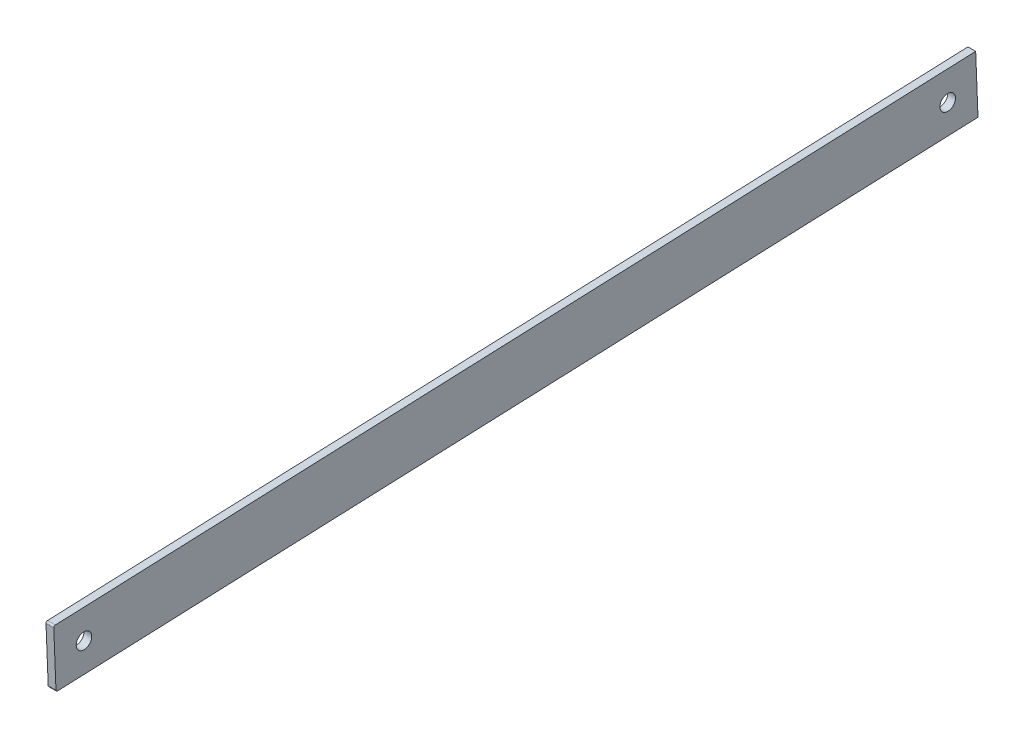
ISO-10303-21;
HEADER;
FILE_DESCRIPTION(('STEP AP214'),'2;1');
FILE_NAME('part.step','',(''),(''),'','','');
FILE_SCHEMA(('AUTOMOTIVE_DESIGN { 1 0 10303 214 1 1 1 1 }'));
ENDSEC;
DATA;
#1=APPLICATION_CONTEXT('core data for automotive mechanical design processes');
#2=APPLICATION_PROTOCOL_DEFINITION('international standard','automotive_design',2000,#1);
#3=PRODUCT_CONTEXT('',#1,'mechanical');
#4=PRODUCT('Part','Part','',(#3));
#5=PRODUCT_RELATED_PRODUCT_CATEGORY('part','',(#4));
#6=PRODUCT_DEFINITION_FORMATION('','',#4);
#7=PRODUCT_DEFINITION_CONTEXT('part definition',#1,'design');
#8=PRODUCT_DEFINITION('design','',#6,#7);
#9=PRODUCT_DEFINITION_SHAPE('','',#8);
#10=(LENGTH_UNIT() NAMED_UNIT(*) SI_UNIT(.MILLI.,.METRE.));
#11=(NAMED_UNIT(*) PLANE_ANGLE_UNIT() SI_UNIT($,.RADIAN.));
#12=(NAMED_UNIT(*) SI_UNIT($,.STERADIAN.) SOLID_ANGLE_UNIT());
#13=UNCERTAINTY_MEASURE_WITH_UNIT(LENGTH_MEASURE(1.E-05),#10,'distance_accuracy_value','');
#14=(GEOMETRIC_REPRESENTATION_CONTEXT(3) GLOBAL_UNCERTAINTY_ASSIGNED_CONTEXT((#13)) GLOBAL_UNIT_ASSIGNED_CONTEXT((#10,
#11,#12)) REPRESENTATION_CONTEXT('',''));
#15=CARTESIAN_POINT('',(0.,0.,0.));
#16=DIRECTION('',(0.,0.,1.));
#17=DIRECTION('',(1.,0.,0.));
#18=AXIS2_PLACEMENT_3D('',#15,#16,#17);
#19=CARTESIAN_POINT('',(5.4000000000002,235.88453851611,673.158651446747));
#20=DIRECTION('',(0.,0.999209085780476,0.0397643419880928));
#21=DIRECTION('',(0.,-0.0397643419880928,0.999209085780476));
#22=AXIS2_PLACEMENT_3D('',#19,#20,#21);
#23=PLANE('',#22);
#24=DIRECTION('',(0.,0.0397643419880928,-0.999209085780476));
#25=VECTOR('',#24,1.);
#26=CARTESIAN_POINT('',(1.4000000000002,235.88453851611,673.158651446747));
#27=LINE('',#26,#25);
#28=CARTESIAN_POINT('',(1.4000000000002,235.884538516109,673.158651446747));
#29=VERTEX_POINT('',#28);
#30=CARTESIAN_POINT('',(1.4000000000002,254.739115198649,199.375774934452));
#31=VERTEX_POINT('',#30);
#32=EDGE_CURVE('E132',#29,#31,#27,.T.);
#33=ORIENTED_EDGE('',*,*,#32,.F.);
#34=DIRECTION('',(-1.,0.,0.));
#35=VECTOR('',#34,1.);
#36=CARTESIAN_POINT('',(5.4000000000002,235.884538516109,673.158651446747));
#37=LINE('',#36,#35);
#38=CARTESIAN_POINT('',(5.4000000000002,235.884538516109,673.158651446747));
#39=VERTEX_POINT('',#38);
#40=EDGE_CURVE('E11',#39,#29,#37,.T.);
#41=ORIENTED_EDGE('',*,*,#40,.F.);
#42=DIRECTION('',(0.,0.0397643419880928,-0.999209085780476));
#43=VECTOR('',#42,1.);
#44=CARTESIAN_POINT('',(5.4000000000002,235.88453851611,673.158651446747));
#45=LINE('',#44,#43);
#46=CARTESIAN_POINT('',(5.4000000000002,254.739115198649,199.375774934452));
#47=VERTEX_POINT('',#46);
#48=EDGE_CURVE('E153',#39,#47,#45,.T.);
#49=ORIENTED_EDGE('',*,*,#48,.T.);
#50=DIRECTION('',(-1.,0.,0.));
#51=VECTOR('',#50,1.);
#52=CARTESIAN_POINT('',(5.4000000000002,254.739115198649,199.375774934452));
#53=LINE('',#52,#51);
#54=EDGE_CURVE('E44',#47,#31,#53,.T.);
#55=ORIENTED_EDGE('',*,*,#54,.T.);
#56=EDGE_LOOP('',(#33,#41,#49,#55));
#57=FACE_BOUND('',#56,.T.);
#58=ADVANCED_FACE('F41',(#57),#23,.T.);
#59=CARTESIAN_POINT('',(5.4000000000002,235.043099282677,673.125165684942));
#60=DIRECTION('',(-1.,0.,0.));
#61=DIRECTION('',(0.,0.,1.));
#62=AXIS2_PLACEMENT_3D('',#59,#60,#61);
#63=CYLINDRICAL_SURFACE('',#62,0.842105266462242);
#64=CARTESIAN_POINT('',(1.4000000000002,235.043099282677,673.125165684942));
#65=DIRECTION('',(-1.,0.,0.));
#66=DIRECTION('',(0.,0.,-1.));
#67=AXIS2_PLACEMENT_3D('',#64,#65,#66);
#68=CIRCLE('',#67,0.842105266462242);
#69=CARTESIAN_POINT('',(1.4000000000002,235.009613520873,673.966604918373));
#70=VERTEX_POINT('',#69);
#71=EDGE_CURVE('E150',#70,#29,#68,.T.);
#72=ORIENTED_EDGE('',*,*,#71,.F.);
#73=DIRECTION('',(-1.,0.,0.));
#74=VECTOR('',#73,1.);
#75=CARTESIAN_POINT('',(5.4000000000002,235.009613520873,673.966604918373));
#76=LINE('',#75,#74);
#77=CARTESIAN_POINT('',(5.4000000000002,235.009613520873,673.966604918373));
#78=VERTEX_POINT('',#77);
#79=EDGE_CURVE('E51',#78,#70,#76,.T.);
#80=ORIENTED_EDGE('',*,*,#79,.F.);
#81=CARTESIAN_POINT('',(5.4000000000002,235.043099282677,673.125165684942));
#82=DIRECTION('',(-1.,0.,0.));
#83=DIRECTION('',(0.,0.,-1.));
#84=AXIS2_PLACEMENT_3D('',#81,#82,#83);
#85=CIRCLE('',#84,0.842105266462242);
#86=EDGE_CURVE('E118',#78,#39,#85,.T.);
#87=ORIENTED_EDGE('',*,*,#86,.T.);
#88=ORIENTED_EDGE('',*,*,#40,.T.);
#89=EDGE_LOOP('',(#72,#80,#87,#88));
#90=FACE_BOUND('',#89,.T.);
#91=ADVANCED_FACE('F165',(#90),#63,.T.);
#92=CARTESIAN_POINT('',(5.4000000000002,206.716219414322,672.840646182342));
#93=DIRECTION('',(0.,-0.0397643419880936,0.999209085780476));
#94=DIRECTION('',(0.,-0.999209085780476,-0.0397643419880936));
#95=AXIS2_PLACEMENT_3D('',#92,#93,#94);
#96=PLANE('',#95);
#97=DIRECTION('',(0.,0.999209085780476,0.0397643419880936));
#98=VECTOR('',#97,1.);
#99=CARTESIAN_POINT('',(1.4000000000002,206.716219414322,672.840646182342));
#100=LINE('',#99,#98);
#101=CARTESIAN_POINT('',(1.4000000000002,206.716219414323,672.840646182339));
#102=VERTEX_POINT('',#101);
#103=EDGE_CURVE('E104',#102,#70,#100,.T.);
#104=ORIENTED_EDGE('',*,*,#103,.F.);
#105=DIRECTION('',(-1.,0.,0.));
#106=VECTOR('',#105,1.);
#107=CARTESIAN_POINT('',(5.4000000000002,206.716219414323,672.840646182339));
#108=LINE('',#107,#106);
#109=CARTESIAN_POINT('',(5.4000000000002,206.716219414323,672.840646182339));
#110=VERTEX_POINT('',#109);
#111=EDGE_CURVE('E99',#110,#102,#108,.T.);
#112=ORIENTED_EDGE('',*,*,#111,.F.);
#113=DIRECTION('',(0.,0.999209085780476,0.0397643419880936));
#114=VECTOR('',#113,1.);
#115=CARTESIAN_POINT('',(5.4000000000002,206.716219414322,672.840646182342));
#116=LINE('',#115,#114);
#117=EDGE_CURVE('E102',#110,#78,#116,.T.);
#118=ORIENTED_EDGE('',*,*,#117,.T.);
#119=ORIENTED_EDGE('',*,*,#79,.T.);
#120=EDGE_LOOP('',(#104,#112,#118,#119));
#121=FACE_BOUND('',#120,.T.);
#122=ADVANCED_FACE('F101',(#121),#96,.T.);
#123=CARTESIAN_POINT('',(5.4000000000002,206.749705176125,671.999206948908));
#124=DIRECTION('',(-1.,0.,0.));
#125=DIRECTION('',(0.,0.,1.));
#126=AXIS2_PLACEMENT_3D('',#123,#124,#125);
#127=CYLINDRICAL_SURFACE('',#126,0.842105266460975);
#128=CARTESIAN_POINT('',(1.4000000000002,206.749705176125,671.999206948908));
#129=DIRECTION('',(-1.,0.,0.));
#130=DIRECTION('',(0.,0.,-1.));
#131=AXIS2_PLACEMENT_3D('',#128,#129,#130);
#132=CIRCLE('',#131,0.842105266460975);
#133=CARTESIAN_POINT('',(1.4000000000002,205.908265942696,671.965721187104));
#134=VERTEX_POINT('',#133);
#135=EDGE_CURVE('E145',#134,#102,#132,.T.);
#136=ORIENTED_EDGE('',*,*,#135,.F.);
#137=DIRECTION('',(-1.,0.,0.));
#138=VECTOR('',#137,1.);
#139=CARTESIAN_POINT('',(5.4000000000002,205.908265942696,671.965721187104));
#140=LINE('',#139,#138);
#141=CARTESIAN_POINT('',(5.4000000000002,205.908265942696,671.965721187104));
#142=VERTEX_POINT('',#141);
#143=EDGE_CURVE('E110',#142,#134,#140,.T.);
#144=ORIENTED_EDGE('',*,*,#143,.F.);
#145=CARTESIAN_POINT('',(5.4000000000002,206.749705176125,671.999206948908));
#146=DIRECTION('',(-1.,0.,0.));
#147=DIRECTION('',(0.,0.,-1.));
#148=AXIS2_PLACEMENT_3D('',#145,#146,#147);
#149=CIRCLE('',#148,0.842105266460975);
#150=EDGE_CURVE('E116',#142,#110,#149,.T.);
#151=ORIENTED_EDGE('',*,*,#150,.T.);
#152=ORIENTED_EDGE('',*,*,#111,.T.);
#153=EDGE_LOOP('',(#136,#144,#151,#152));
#154=FACE_BOUND('',#153,.T.);
#155=ADVANCED_FACE('F121',(#154),#127,.T.);
#156=CARTESIAN_POINT('',(5.4000000000002,224.762842625235,198.18284467481));
#157=DIRECTION('',(0.,-0.999209085780476,-0.0397643419880927));
#158=DIRECTION('',(0.,0.0397643419880927,-0.999209085780476));
#159=AXIS2_PLACEMENT_3D('',#156,#157,#158);
#160=PLANE('',#159);
#161=DIRECTION('',(0.,-0.0397643419880927,0.999209085780476));
#162=VECTOR('',#161,1.);
#163=CARTESIAN_POINT('',(1.4000000000002,224.762842625235,198.18284467481));
#164=LINE('',#163,#162);
#165=CARTESIAN_POINT('',(1.4000000000002,224.762842625235,198.18284467481));
#166=VERTEX_POINT('',#165);
#167=EDGE_CURVE('E141',#166,#134,#164,.T.);
#168=ORIENTED_EDGE('',*,*,#167,.F.);
#169=DIRECTION('',(-1.,0.,0.));
#170=VECTOR('',#169,1.);
#171=CARTESIAN_POINT('',(5.4000000000002,224.762842625235,198.18284467481));
#172=LINE('',#171,#170);
#173=CARTESIAN_POINT('',(5.4000000000002,224.762842625235,198.18284467481));
#174=VERTEX_POINT('',#173);
#175=EDGE_CURVE('E158',#174,#166,#172,.T.);
#176=ORIENTED_EDGE('',*,*,#175,.F.);
#177=DIRECTION('',(0.,-0.0397643419880927,0.999209085780476));
#178=VECTOR('',#177,1.);
#179=CARTESIAN_POINT('',(5.4000000000002,224.762842625235,198.18284467481));
#180=LINE('',#179,#178);
#181=EDGE_CURVE('E123',#174,#142,#180,.T.);
#182=ORIENTED_EDGE('',*,*,#181,.T.);
#183=ORIENTED_EDGE('',*,*,#143,.T.);
#184=EDGE_LOOP('',(#168,#176,#182,#183));
#185=FACE_BOUND('',#184,.T.);
#186=ADVANCED_FACE('F178',(#185),#160,.T.);
#187=CARTESIAN_POINT('',(5.4000000000002,254.739115198649,199.375774934452));
#188=DIRECTION('',(0.,0.0397643419880782,-0.999209085780476));
#189=DIRECTION('',(0.,0.999209085780476,0.0397643419880782));
#190=AXIS2_PLACEMENT_3D('',#187,#188,#189);
#191=PLANE('',#190);
#192=DIRECTION('',(0.,-0.999209085780476,-0.0397643419880782));
#193=VECTOR('',#192,1.);
#194=CARTESIAN_POINT('',(1.4000000000002,254.739115198649,199.375774934452));
#195=LINE('',#194,#193);
#196=EDGE_CURVE('E136',#31,#166,#195,.T.);
#197=ORIENTED_EDGE('',*,*,#196,.F.);
#198=ORIENTED_EDGE('',*,*,#54,.F.);
#199=DIRECTION('',(0.,-0.999209085780476,-0.0397643419880782));
#200=VECTOR('',#199,1.);
#201=CARTESIAN_POINT('',(5.4000000000002,254.739115198649,199.375774934452));
#202=LINE('',#201,#200);
#203=EDGE_CURVE('E126',#47,#174,#202,.T.);
#204=ORIENTED_EDGE('',*,*,#203,.T.);
#205=ORIENTED_EDGE('',*,*,#175,.T.);
#206=EDGE_LOOP('',(#197,#198,#204,#205));
#207=FACE_BOUND('',#206,.T.);
#208=ADVANCED_FACE('F162',(#207),#191,.T.);
#209=CARTESIAN_POINT('',(5.4000000000002,206.749705176125,671.999206948908));
#210=DIRECTION('',(1.,0.,0.));
#211=DIRECTION('',(0.,0.,-1.));
#212=AXIS2_PLACEMENT_3D('',#209,#210,#211);
#213=PLANE('',#212);
#214=CARTESIAN_POINT('',(5.4000000000002,239.15451378212,213.767446091338));
#215=DIRECTION('',(-1.,0.,0.));
#216=DIRECTION('',(0.,0.,-1.));
#217=AXIS2_PLACEMENT_3D('',#214,#215,#216);
#218=CIRCLE('',#217,3.99999999999999);
#219=CARTESIAN_POINT('',(5.4000000000002,239.15451378212,209.767446091338));
#220=VERTEX_POINT('',#219);
#221=EDGE_CURVE('E204',#220,#220,#218,.T.);
#222=ORIENTED_EDGE('',*,*,#221,.T.);
#223=EDGE_LOOP('',(#222));
#224=FACE_BOUND('',#223,.T.);
#225=CARTESIAN_POINT('',(5.4000000000002,221.459381597418,658.41548926365));
#226=DIRECTION('',(-1.,0.,0.));
#227=DIRECTION('',(0.,0.,-1.));
#228=AXIS2_PLACEMENT_3D('',#225,#226,#227);
#229=CIRCLE('',#228,4.00000000001945);
#230=CARTESIAN_POINT('',(5.4000000000002,221.459381597418,654.41548926363));
#231=VERTEX_POINT('',#230);
#232=EDGE_CURVE('E137',#231,#231,#229,.T.);
#233=ORIENTED_EDGE('',*,*,#232,.T.);
#234=EDGE_LOOP('',(#233));
#235=FACE_BOUND('',#234,.T.);
#236=ORIENTED_EDGE('',*,*,#48,.F.);
#237=ORIENTED_EDGE('',*,*,#86,.F.);
#238=ORIENTED_EDGE('',*,*,#117,.F.);
#239=ORIENTED_EDGE('',*,*,#150,.F.);
#240=ORIENTED_EDGE('',*,*,#181,.F.);
#241=ORIENTED_EDGE('',*,*,#203,.F.);
#242=EDGE_LOOP('',(#236,#237,#238,#239,#240,#241));
#243=FACE_BOUND('',#242,.T.);
#244=ADVANCED_FACE('F114',(#224,#235,#243),#213,.T.);
#245=CARTESIAN_POINT('',(1.4000000000002,206.749705176125,671.999206948908));
#246=DIRECTION('',(1.,0.,0.));
#247=DIRECTION('',(0.,0.,-1.));
#248=AXIS2_PLACEMENT_3D('',#245,#246,#247);
#249=PLANE('',#248);
#250=CARTESIAN_POINT('',(1.4000000000002,239.15451378212,213.767446091338));
#251=DIRECTION('',(-1.,0.,0.));
#252=DIRECTION('',(0.,0.,-1.));
#253=AXIS2_PLACEMENT_3D('',#250,#251,#252);
#254=CIRCLE('',#253,3.99999999999999);
#255=CARTESIAN_POINT('',(1.4000000000002,239.15451378212,209.767446091338));
#256=VERTEX_POINT('',#255);
#257=EDGE_CURVE('E207',#256,#256,#254,.T.);
#258=ORIENTED_EDGE('',*,*,#257,.F.);
#259=EDGE_LOOP('',(#258));
#260=FACE_BOUND('',#259,.T.);
#261=CARTESIAN_POINT('',(1.4000000000002,221.459381597418,658.41548926365));
#262=DIRECTION('',(-1.,0.,0.));
#263=DIRECTION('',(0.,0.,-1.));
#264=AXIS2_PLACEMENT_3D('',#261,#262,#263);
#265=CIRCLE('',#264,4.00000000001945);
#266=CARTESIAN_POINT('',(1.4000000000002,221.459381597418,654.41548926363));
#267=VERTEX_POINT('',#266);
#268=EDGE_CURVE('E211',#267,#267,#265,.T.);
#269=ORIENTED_EDGE('',*,*,#268,.F.);
#270=EDGE_LOOP('',(#269));
#271=FACE_BOUND('',#270,.T.);
#272=ORIENTED_EDGE('',*,*,#32,.T.);
#273=ORIENTED_EDGE('',*,*,#196,.T.);
#274=ORIENTED_EDGE('',*,*,#167,.T.);
#275=ORIENTED_EDGE('',*,*,#135,.T.);
#276=ORIENTED_EDGE('',*,*,#103,.T.);
#277=ORIENTED_EDGE('',*,*,#71,.T.);
#278=EDGE_LOOP('',(#272,#273,#274,#275,#276,#277));
#279=FACE_BOUND('',#278,.T.);
#280=ADVANCED_FACE('F164',(#260,#271,#279),#249,.F.);
#281=CARTESIAN_POINT('',(5.4000000000002,221.459381597418,658.41548926365));
#282=DIRECTION('',(-1.,0.,0.));
#283=DIRECTION('',(0.,0.,1.));
#284=AXIS2_PLACEMENT_3D('',#281,#282,#283);
#285=CYLINDRICAL_SURFACE('',#284,4.00000000001945);
#286=ORIENTED_EDGE('',*,*,#232,.F.);
#287=EDGE_LOOP('',(#286));
#288=FACE_BOUND('',#287,.T.);
#289=ORIENTED_EDGE('',*,*,#268,.T.);
#290=EDGE_LOOP('',(#289));
#291=FACE_BOUND('',#290,.T.);
#292=ADVANCED_FACE('F189',(#288,#291),#285,.F.);
#293=CARTESIAN_POINT('',(5.4000000000002,239.15451378212,213.767446091338));
#294=DIRECTION('',(-1.,0.,0.));
#295=DIRECTION('',(0.,0.,1.));
#296=AXIS2_PLACEMENT_3D('',#293,#294,#295);
#297=CYLINDRICAL_SURFACE('',#296,3.99999999999999);
#298=ORIENTED_EDGE('',*,*,#221,.F.);
#299=EDGE_LOOP('',(#298));
#300=FACE_BOUND('',#299,.T.);
#301=ORIENTED_EDGE('',*,*,#257,.T.);
#302=EDGE_LOOP('',(#301));
#303=FACE_BOUND('',#302,.T.);
#304=ADVANCED_FACE('F196',(#300,#303),#297,.F.);
#305=CLOSED_SHELL('',(#58,#91,#122,#155,#186,#208,#244,#280,#292,#304));
#306=MANIFOLD_SOLID_BREP('B2',#305);
#307=ADVANCED_BREP_SHAPE_REPRESENTATION('',(#18,#306),#14);
#308=SHAPE_DEFINITION_REPRESENTATION(#9,#307);
ENDSEC;
END-ISO-10303-21;
